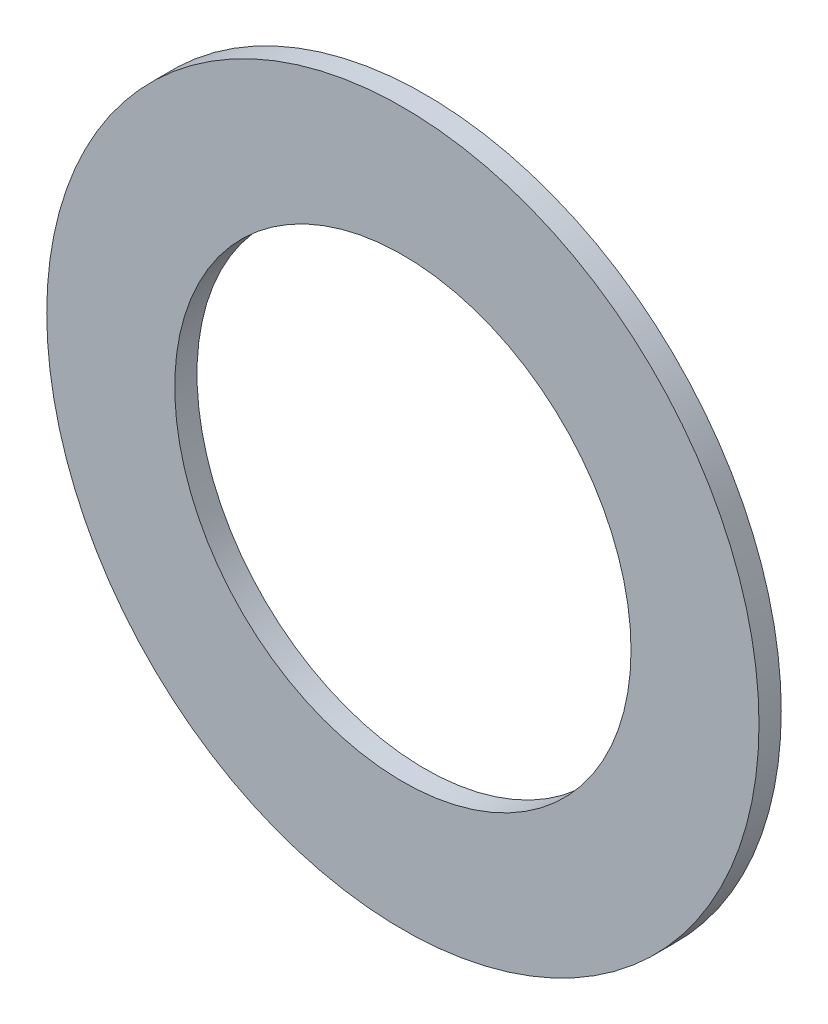
ISO-10303-21;
HEADER;
FILE_DESCRIPTION(('STEP AP214'),'2;1');
FILE_NAME('part.step','',(''),(''),'','','');
FILE_SCHEMA(('AUTOMOTIVE_DESIGN { 1 0 10303 214 1 1 1 1 }'));
ENDSEC;
DATA;
#1=APPLICATION_CONTEXT('core data for automotive mechanical design processes');
#2=APPLICATION_PROTOCOL_DEFINITION('international standard','automotive_design',2000,#1);
#3=PRODUCT_CONTEXT('',#1,'mechanical');
#4=PRODUCT('Part','Part','',(#3));
#5=PRODUCT_RELATED_PRODUCT_CATEGORY('part','',(#4));
#6=PRODUCT_DEFINITION_FORMATION('','',#4);
#7=PRODUCT_DEFINITION_CONTEXT('part definition',#1,'design');
#8=PRODUCT_DEFINITION('design','',#6,#7);
#9=PRODUCT_DEFINITION_SHAPE('','',#8);
#10=(LENGTH_UNIT() NAMED_UNIT(*) SI_UNIT(.MILLI.,.METRE.));
#11=(NAMED_UNIT(*) PLANE_ANGLE_UNIT() SI_UNIT($,.RADIAN.));
#12=(NAMED_UNIT(*) SI_UNIT($,.STERADIAN.) SOLID_ANGLE_UNIT());
#13=UNCERTAINTY_MEASURE_WITH_UNIT(LENGTH_MEASURE(1.E-05),#10,'distance_accuracy_value','');
#14=(GEOMETRIC_REPRESENTATION_CONTEXT(3) GLOBAL_UNCERTAINTY_ASSIGNED_CONTEXT((#13)) GLOBAL_UNIT_ASSIGNED_CONTEXT((#10,
#11,#12)) REPRESENTATION_CONTEXT('',''));
#15=CARTESIAN_POINT('',(0.,0.,0.));
#16=DIRECTION('',(0.,0.,1.));
#17=DIRECTION('',(1.,0.,0.));
#18=AXIS2_PLACEMENT_3D('',#15,#16,#17);
#19=CARTESIAN_POINT('',(0.,0.,1.));
#20=DIRECTION('',(0.,0.,1.));
#21=DIRECTION('',(1.,0.,0.));
#22=AXIS2_PLACEMENT_3D('',#19,#20,#21);
#23=PLANE('',#22);
#24=CARTESIAN_POINT('',(0.,0.,1.));
#25=DIRECTION('',(0.,0.,1.));
#26=DIRECTION('',(1.,0.,0.));
#27=AXIS2_PLACEMENT_3D('',#24,#25,#26);
#28=CIRCLE('',#27,16.);
#29=CARTESIAN_POINT('',(16.,0.,1.));
#30=VERTEX_POINT('',#29);
#31=EDGE_CURVE('E10',#30,#30,#28,.T.);
#32=ORIENTED_EDGE('',*,*,#31,.T.);
#33=EDGE_LOOP('',(#32));
#34=FACE_BOUND('',#33,.T.);
#35=CARTESIAN_POINT('',(0.,0.,1.));
#36=DIRECTION('',(0.,0.,1.));
#37=DIRECTION('',(1.,0.,0.));
#38=AXIS2_PLACEMENT_3D('',#35,#36,#37);
#39=CIRCLE('',#38,10.25);
#40=CARTESIAN_POINT('',(10.25,0.,1.));
#41=VERTEX_POINT('',#40);
#42=EDGE_CURVE('E48',#41,#41,#39,.T.);
#43=ORIENTED_EDGE('',*,*,#42,.F.);
#44=EDGE_LOOP('',(#43));
#45=FACE_BOUND('',#44,.T.);
#46=ADVANCED_FACE('F40',(#34,#45),#23,.T.);
#47=CARTESIAN_POINT('',(0.,0.,0.));
#48=DIRECTION('',(0.,0.,1.));
#49=DIRECTION('',(1.,0.,0.));
#50=AXIS2_PLACEMENT_3D('',#47,#48,#49);
#51=PLANE('',#50);
#52=CARTESIAN_POINT('',(0.,0.,0.));
#53=DIRECTION('',(0.,0.,1.));
#54=DIRECTION('',(1.,0.,0.));
#55=AXIS2_PLACEMENT_3D('',#52,#53,#54);
#56=CIRCLE('',#55,16.);
#57=CARTESIAN_POINT('',(16.,0.,0.));
#58=VERTEX_POINT('',#57);
#59=EDGE_CURVE('E41',#58,#58,#56,.T.);
#60=ORIENTED_EDGE('',*,*,#59,.F.);
#61=EDGE_LOOP('',(#60));
#62=FACE_BOUND('',#61,.T.);
#63=CARTESIAN_POINT('',(0.,0.,0.));
#64=DIRECTION('',(0.,0.,1.));
#65=DIRECTION('',(1.,0.,0.));
#66=AXIS2_PLACEMENT_3D('',#63,#64,#65);
#67=CIRCLE('',#66,10.25);
#68=CARTESIAN_POINT('',(10.25,0.,0.));
#69=VERTEX_POINT('',#68);
#70=EDGE_CURVE('E49',#69,#69,#67,.T.);
#71=ORIENTED_EDGE('',*,*,#70,.T.);
#72=EDGE_LOOP('',(#71));
#73=FACE_BOUND('',#72,.T.);
#74=ADVANCED_FACE('F58',(#62,#73),#51,.F.);
#75=CARTESIAN_POINT('',(0.,0.,1.));
#76=DIRECTION('',(0.,0.,-1.));
#77=DIRECTION('',(-1.,0.,0.));
#78=AXIS2_PLACEMENT_3D('',#75,#76,#77);
#79=CYLINDRICAL_SURFACE('',#78,16.);
#80=ORIENTED_EDGE('',*,*,#31,.F.);
#81=EDGE_LOOP('',(#80));
#82=FACE_BOUND('',#81,.T.);
#83=ORIENTED_EDGE('',*,*,#59,.T.);
#84=EDGE_LOOP('',(#83));
#85=FACE_BOUND('',#84,.T.);
#86=ADVANCED_FACE('F39',(#82,#85),#79,.T.);
#87=CARTESIAN_POINT('',(0.,0.,1.));
#88=DIRECTION('',(0.,0.,-1.));
#89=DIRECTION('',(-1.,0.,0.));
#90=AXIS2_PLACEMENT_3D('',#87,#88,#89);
#91=CYLINDRICAL_SURFACE('',#90,10.25);
#92=ORIENTED_EDGE('',*,*,#42,.T.);
#93=EDGE_LOOP('',(#92));
#94=FACE_BOUND('',#93,.T.);
#95=ORIENTED_EDGE('',*,*,#70,.F.);
#96=EDGE_LOOP('',(#95));
#97=FACE_BOUND('',#96,.T.);
#98=ADVANCED_FACE('F57',(#94,#97),#91,.F.);
#99=CLOSED_SHELL('',(#46,#74,#86,#98));
#100=MANIFOLD_SOLID_BREP('B2',#99);
#101=ADVANCED_BREP_SHAPE_REPRESENTATION('',(#18,#100),#14);
#102=SHAPE_DEFINITION_REPRESENTATION(#9,#101);
ENDSEC;
END-ISO-10303-21;
